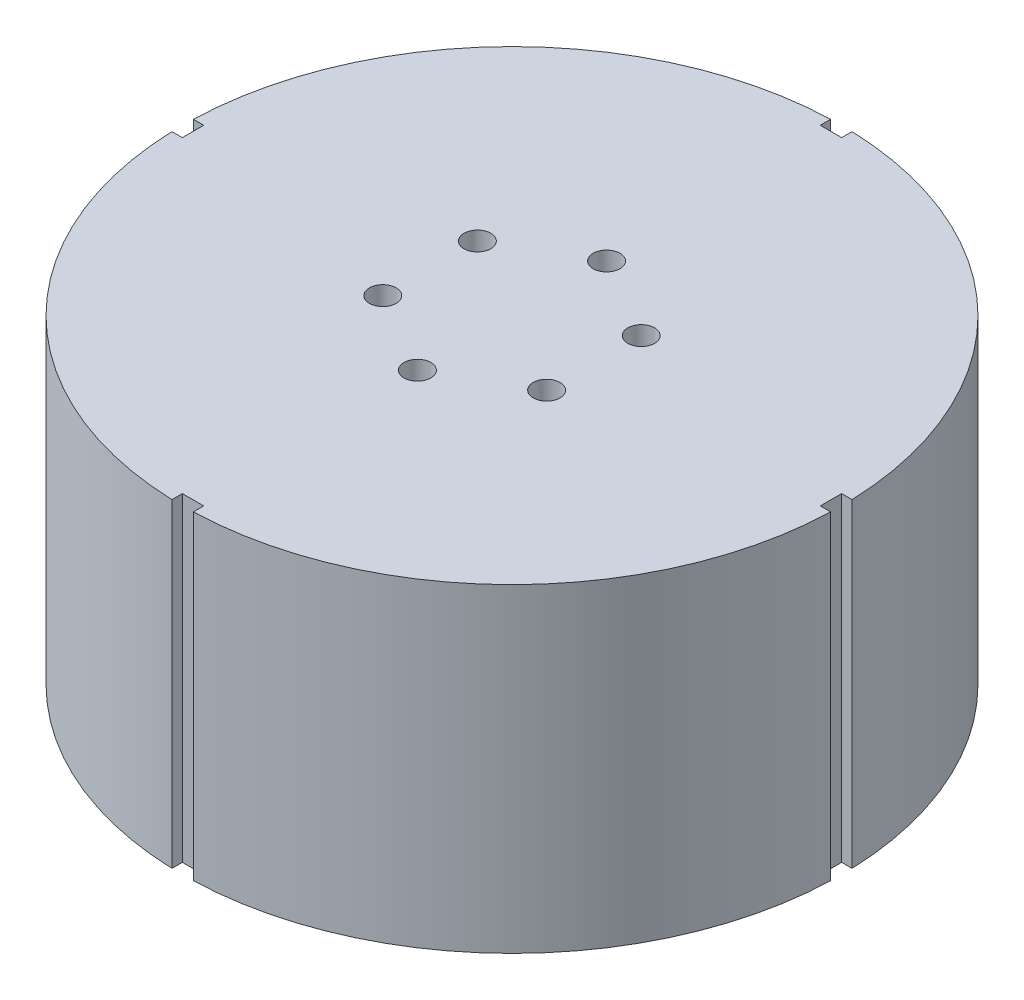
ISO-10303-21;
HEADER;
FILE_DESCRIPTION(('STEP AP214'),'2;1');
FILE_NAME('part.step','',(''),(''),'','','');
FILE_SCHEMA(('AUTOMOTIVE_DESIGN { 1 0 10303 214 1 1 1 1 }'));
ENDSEC;
DATA;
#1=APPLICATION_CONTEXT('core data for automotive mechanical design processes');
#2=APPLICATION_PROTOCOL_DEFINITION('international standard','automotive_design',2000,#1);
#3=PRODUCT_CONTEXT('',#1,'mechanical');
#4=PRODUCT('Part','Part','',(#3));
#5=PRODUCT_RELATED_PRODUCT_CATEGORY('part','',(#4));
#6=PRODUCT_DEFINITION_FORMATION('','',#4);
#7=PRODUCT_DEFINITION_CONTEXT('part definition',#1,'design');
#8=PRODUCT_DEFINITION('design','',#6,#7);
#9=PRODUCT_DEFINITION_SHAPE('','',#8);
#10=(LENGTH_UNIT() NAMED_UNIT(*) SI_UNIT(.MILLI.,.METRE.));
#11=(NAMED_UNIT(*) PLANE_ANGLE_UNIT() SI_UNIT($,.RADIAN.));
#12=(NAMED_UNIT(*) SI_UNIT($,.STERADIAN.) SOLID_ANGLE_UNIT());
#13=UNCERTAINTY_MEASURE_WITH_UNIT(LENGTH_MEASURE(1.E-05),#10,'distance_accuracy_value','');
#14=(GEOMETRIC_REPRESENTATION_CONTEXT(3) GLOBAL_UNCERTAINTY_ASSIGNED_CONTEXT((#13)) GLOBAL_UNIT_ASSIGNED_CONTEXT((#10,
#11,#12)) REPRESENTATION_CONTEXT('',''));
#15=CARTESIAN_POINT('',(0.,0.,0.));
#16=DIRECTION('',(0.,0.,1.));
#17=DIRECTION('',(1.,0.,0.));
#18=AXIS2_PLACEMENT_3D('',#15,#16,#17);
#19=CARTESIAN_POINT('',(13.4233937586588,80.,7.75));
#20=DIRECTION('',(0.,-1.,0.));
#21=DIRECTION('',(0.,0.,-1.));
#22=AXIS2_PLACEMENT_3D('',#19,#20,#21);
#23=CYLINDRICAL_SURFACE('',#22,2.2);
#24=CARTESIAN_POINT('',(13.4233937586588,52.34,7.75));
#25=DIRECTION('',(0.,1.,0.));
#26=DIRECTION('',(0.,0.,1.));
#27=AXIS2_PLACEMENT_3D('',#24,#25,#26);
#28=CIRCLE('',#27,2.2);
#29=CARTESIAN_POINT('',(13.4233937586588,52.34,9.95));
#30=VERTEX_POINT('',#29);
#31=EDGE_CURVE('E394',#30,#30,#28,.T.);
#32=ORIENTED_EDGE('',*,*,#31,.T.);
#33=EDGE_LOOP('',(#32));
#34=FACE_BOUND('',#33,.T.);
#35=CARTESIAN_POINT('',(13.4233937586588,30.,7.75));
#36=DIRECTION('',(0.,-1.,0.));
#37=DIRECTION('',(0.,0.,-1.));
#38=AXIS2_PLACEMENT_3D('',#35,#36,#37);
#39=CIRCLE('',#38,2.2);
#40=CARTESIAN_POINT('',(13.4233937586588,30.,5.55));
#41=VERTEX_POINT('',#40);
#42=EDGE_CURVE('E398',#41,#41,#39,.F.);
#43=ORIENTED_EDGE('',*,*,#42,.F.);
#44=EDGE_LOOP('',(#43));
#45=FACE_BOUND('',#44,.T.);
#46=ADVANCED_FACE('F45',(#34,#45),#23,.F.);
#47=CARTESIAN_POINT('',(13.4233937586588,80.,-7.74999999999999));
#48=DIRECTION('',(0.,-1.,0.));
#49=DIRECTION('',(0.,0.,-1.));
#50=AXIS2_PLACEMENT_3D('',#47,#48,#49);
#51=CYLINDRICAL_SURFACE('',#50,2.2);
#52=CARTESIAN_POINT('',(13.4233937586588,52.34,-7.74999999999999));
#53=DIRECTION('',(0.,1.,0.));
#54=DIRECTION('',(0.,0.,1.));
#55=AXIS2_PLACEMENT_3D('',#52,#53,#54);
#56=CIRCLE('',#55,2.2);
#57=CARTESIAN_POINT('',(13.4233937586588,52.34,-5.54999999999999));
#58=VERTEX_POINT('',#57);
#59=EDGE_CURVE('E390',#58,#58,#56,.T.);
#60=ORIENTED_EDGE('',*,*,#59,.T.);
#61=EDGE_LOOP('',(#60));
#62=FACE_BOUND('',#61,.T.);
#63=CARTESIAN_POINT('',(13.4233937586588,30.,-7.74999999999999));
#64=DIRECTION('',(0.,-1.,0.));
#65=DIRECTION('',(0.,0.,-1.));
#66=AXIS2_PLACEMENT_3D('',#63,#64,#65);
#67=CIRCLE('',#66,2.2);
#68=CARTESIAN_POINT('',(13.4233937586588,30.,-9.94999999999999));
#69=VERTEX_POINT('',#68);
#70=EDGE_CURVE('E402',#69,#69,#67,.F.);
#71=ORIENTED_EDGE('',*,*,#70,.F.);
#72=EDGE_LOOP('',(#71));
#73=FACE_BOUND('',#72,.T.);
#74=ADVANCED_FACE('F445',(#62,#73),#51,.F.);
#75=CARTESIAN_POINT('',(0.,80.,-15.5));
#76=DIRECTION('',(0.,-1.,0.));
#77=DIRECTION('',(0.,0.,-1.));
#78=AXIS2_PLACEMENT_3D('',#75,#76,#77);
#79=CYLINDRICAL_SURFACE('',#78,2.2);
#80=CARTESIAN_POINT('',(0.,52.34,-15.5));
#81=DIRECTION('',(0.,1.,0.));
#82=DIRECTION('',(0.,0.,1.));
#83=AXIS2_PLACEMENT_3D('',#80,#81,#82);
#84=CIRCLE('',#83,2.2);
#85=CARTESIAN_POINT('',(0.,52.34,-13.3));
#86=VERTEX_POINT('',#85);
#87=EDGE_CURVE('E386',#86,#86,#84,.T.);
#88=ORIENTED_EDGE('',*,*,#87,.T.);
#89=EDGE_LOOP('',(#88));
#90=FACE_BOUND('',#89,.T.);
#91=CARTESIAN_POINT('',(0.,30.,-15.5));
#92=DIRECTION('',(0.,-1.,0.));
#93=DIRECTION('',(0.,0.,-1.));
#94=AXIS2_PLACEMENT_3D('',#91,#92,#93);
#95=CIRCLE('',#94,2.2);
#96=CARTESIAN_POINT('',(0.,30.,-17.7));
#97=VERTEX_POINT('',#96);
#98=EDGE_CURVE('E406',#97,#97,#95,.F.);
#99=ORIENTED_EDGE('',*,*,#98,.F.);
#100=EDGE_LOOP('',(#99));
#101=FACE_BOUND('',#100,.T.);
#102=ADVANCED_FACE('F451',(#90,#101),#79,.F.);
#103=CARTESIAN_POINT('',(-13.4233937586588,80.,-7.75000000000001));
#104=DIRECTION('',(0.,-1.,0.));
#105=DIRECTION('',(0.,0.,-1.));
#106=AXIS2_PLACEMENT_3D('',#103,#104,#105);
#107=CYLINDRICAL_SURFACE('',#106,2.2);
#108=CARTESIAN_POINT('',(-13.4233937586588,52.34,-7.75000000000001));
#109=DIRECTION('',(0.,1.,0.));
#110=DIRECTION('',(0.,0.,1.));
#111=AXIS2_PLACEMENT_3D('',#108,#109,#110);
#112=CIRCLE('',#111,2.2);
#113=CARTESIAN_POINT('',(-13.4233937586588,52.34,-5.55));
#114=VERTEX_POINT('',#113);
#115=EDGE_CURVE('E382',#114,#114,#112,.T.);
#116=ORIENTED_EDGE('',*,*,#115,.T.);
#117=EDGE_LOOP('',(#116));
#118=FACE_BOUND('',#117,.T.);
#119=CARTESIAN_POINT('',(-13.4233937586588,30.,-7.75000000000001));
#120=DIRECTION('',(0.,-1.,0.));
#121=DIRECTION('',(0.,0.,-1.));
#122=AXIS2_PLACEMENT_3D('',#119,#120,#121);
#123=CIRCLE('',#122,2.2);
#124=CARTESIAN_POINT('',(-13.4233937586588,30.,-9.95000000000001));
#125=VERTEX_POINT('',#124);
#126=EDGE_CURVE('E410',#125,#125,#123,.F.);
#127=ORIENTED_EDGE('',*,*,#126,.F.);
#128=EDGE_LOOP('',(#127));
#129=FACE_BOUND('',#128,.T.);
#130=ADVANCED_FACE('F461',(#118,#129),#107,.F.);
#131=CARTESIAN_POINT('',(-13.4233937586588,80.,7.75));
#132=DIRECTION('',(0.,-1.,0.));
#133=DIRECTION('',(0.,0.,-1.));
#134=AXIS2_PLACEMENT_3D('',#131,#132,#133);
#135=CYLINDRICAL_SURFACE('',#134,2.2);
#136=CARTESIAN_POINT('',(-13.4233937586588,52.34,7.75));
#137=DIRECTION('',(0.,1.,0.));
#138=DIRECTION('',(0.,0.,1.));
#139=AXIS2_PLACEMENT_3D('',#136,#137,#138);
#140=CIRCLE('',#139,2.2);
#141=CARTESIAN_POINT('',(-13.4233937586588,52.34,9.95));
#142=VERTEX_POINT('',#141);
#143=EDGE_CURVE('E378',#142,#142,#140,.T.);
#144=ORIENTED_EDGE('',*,*,#143,.T.);
#145=EDGE_LOOP('',(#144));
#146=FACE_BOUND('',#145,.T.);
#147=CARTESIAN_POINT('',(-13.4233937586588,30.,7.75));
#148=DIRECTION('',(0.,-1.,0.));
#149=DIRECTION('',(0.,0.,-1.));
#150=AXIS2_PLACEMENT_3D('',#147,#148,#149);
#151=CIRCLE('',#150,2.2);
#152=CARTESIAN_POINT('',(-13.4233937586588,30.,5.55));
#153=VERTEX_POINT('',#152);
#154=EDGE_CURVE('E414',#153,#153,#151,.F.);
#155=ORIENTED_EDGE('',*,*,#154,.F.);
#156=EDGE_LOOP('',(#155));
#157=FACE_BOUND('',#156,.T.);
#158=ADVANCED_FACE('F456',(#146,#157),#135,.F.);
#159=CARTESIAN_POINT('',(0.,80.,15.5));
#160=DIRECTION('',(0.,-1.,0.));
#161=DIRECTION('',(0.,0.,-1.));
#162=AXIS2_PLACEMENT_3D('',#159,#160,#161);
#163=CYLINDRICAL_SURFACE('',#162,2.2);
#164=CARTESIAN_POINT('',(0.,52.34,15.5));
#165=DIRECTION('',(0.,1.,0.));
#166=DIRECTION('',(0.,0.,1.));
#167=AXIS2_PLACEMENT_3D('',#164,#165,#166);
#168=CIRCLE('',#167,2.2);
#169=CARTESIAN_POINT('',(0.,52.34,17.7));
#170=VERTEX_POINT('',#169);
#171=EDGE_CURVE('E238',#170,#170,#168,.T.);
#172=ORIENTED_EDGE('',*,*,#171,.T.);
#173=EDGE_LOOP('',(#172));
#174=FACE_BOUND('',#173,.T.);
#175=CARTESIAN_POINT('',(0.,30.,15.5));
#176=DIRECTION('',(0.,-1.,0.));
#177=DIRECTION('',(0.,0.,-1.));
#178=AXIS2_PLACEMENT_3D('',#175,#176,#177);
#179=CIRCLE('',#178,2.2);
#180=CARTESIAN_POINT('',(0.,30.,13.3));
#181=VERTEX_POINT('',#180);
#182=EDGE_CURVE('E49',#181,#181,#179,.F.);
#183=ORIENTED_EDGE('',*,*,#182,.F.);
#184=EDGE_LOOP('',(#183));
#185=FACE_BOUND('',#184,.T.);
#186=ADVANCED_FACE('F442',(#174,#185),#163,.F.);
#187=CARTESIAN_POINT('',(0.,52.34,52.2716360693281));
#188=DIRECTION('',(0.,0.,-1.));
#189=DIRECTION('',(-1.,0.,0.));
#190=AXIS2_PLACEMENT_3D('',#187,#188,#189);
#191=PLANE('',#190);
#192=DIRECTION('',(1.,0.,0.));
#193=VECTOR('',#192,1.);
#194=CARTESIAN_POINT('',(0.,0.,52.2716360693281));
#195=LINE('',#194,#193);
#196=CARTESIAN_POINT('',(-1.74999999999999,0.,52.2716360693281));
#197=VERTEX_POINT('',#196);
#198=CARTESIAN_POINT('',(1.75000000000001,0.,52.2716360693281));
#199=VERTEX_POINT('',#198);
#200=EDGE_CURVE('E233',#197,#199,#195,.T.);
#201=ORIENTED_EDGE('',*,*,#200,.T.);
#202=DIRECTION('',(0.,-1.,0.));
#203=VECTOR('',#202,1.);
#204=CARTESIAN_POINT('',(1.75000000000001,52.34,52.2716360693281));
#205=LINE('',#204,#203);
#206=CARTESIAN_POINT('',(1.75000000000001,52.34,52.2716360693281));
#207=VERTEX_POINT('',#206);
#208=EDGE_CURVE('E11',#207,#199,#205,.T.);
#209=ORIENTED_EDGE('',*,*,#208,.F.);
#210=DIRECTION('',(1.,0.,0.));
#211=VECTOR('',#210,1.);
#212=CARTESIAN_POINT('',(0.,52.34,52.2716360693281));
#213=LINE('',#212,#211);
#214=CARTESIAN_POINT('',(-1.74999999999999,52.34,52.2716360693281));
#215=VERTEX_POINT('',#214);
#216=EDGE_CURVE('E209',#215,#207,#213,.T.);
#217=ORIENTED_EDGE('',*,*,#216,.F.);
#218=DIRECTION('',(0.,-1.,0.));
#219=VECTOR('',#218,1.);
#220=CARTESIAN_POINT('',(-1.74999999999999,52.34,52.2716360693281));
#221=LINE('',#220,#219);
#222=EDGE_CURVE('E194',#215,#197,#221,.T.);
#223=ORIENTED_EDGE('',*,*,#222,.T.);
#224=EDGE_LOOP('',(#201,#209,#217,#223));
#225=FACE_BOUND('',#224,.T.);
#226=ADVANCED_FACE('F47',(#225),#191,.F.);
#227=CARTESIAN_POINT('',(1.74999999999997,52.34,0.));
#228=DIRECTION('',(1.,0.,0.));
#229=DIRECTION('',(0.,0.,-1.));
#230=AXIS2_PLACEMENT_3D('',#227,#228,#229);
#231=PLANE('',#230);
#232=DIRECTION('',(0.,0.,1.));
#233=VECTOR('',#232,1.);
#234=CARTESIAN_POINT('',(1.74999999999997,0.,0.));
#235=LINE('',#234,#233);
#236=CARTESIAN_POINT('',(1.75000000000001,0.,53.9716360693281));
#237=VERTEX_POINT('',#236);
#238=EDGE_CURVE('E237',#199,#237,#235,.T.);
#239=ORIENTED_EDGE('',*,*,#238,.T.);
#240=DIRECTION('',(0.,-1.,0.));
#241=VECTOR('',#240,1.);
#242=CARTESIAN_POINT('',(1.75000000000001,52.34,53.9716360693281));
#243=LINE('',#242,#241);
#244=CARTESIAN_POINT('',(1.75000000000001,52.34,53.9716360693281));
#245=VERTEX_POINT('',#244);
#246=EDGE_CURVE('E56',#245,#237,#243,.T.);
#247=ORIENTED_EDGE('',*,*,#246,.F.);
#248=DIRECTION('',(0.,0.,1.));
#249=VECTOR('',#248,1.);
#250=CARTESIAN_POINT('',(1.74999999999997,52.34,0.));
#251=LINE('',#250,#249);
#252=EDGE_CURVE('E131',#207,#245,#251,.T.);
#253=ORIENTED_EDGE('',*,*,#252,.F.);
#254=ORIENTED_EDGE('',*,*,#208,.T.);
#255=EDGE_LOOP('',(#239,#247,#253,#254));
#256=FACE_BOUND('',#255,.T.);
#257=ADVANCED_FACE('F435',(#256),#231,.F.);
#258=CARTESIAN_POINT('',(0.,52.34,0.));
#259=DIRECTION('',(0.,-1.,0.));
#260=DIRECTION('',(0.,0.,-1.));
#261=AXIS2_PLACEMENT_3D('',#258,#259,#260);
#262=CYLINDRICAL_SURFACE('',#261,54.);
#263=CARTESIAN_POINT('',(0.,0.,0.));
#264=DIRECTION('',(0.,1.,0.));
#265=DIRECTION('',(0.,0.,1.));
#266=AXIS2_PLACEMENT_3D('',#263,#264,#265);
#267=CIRCLE('',#266,54.);
#268=CARTESIAN_POINT('',(53.9716360693281,0.,1.74999999999998));
#269=VERTEX_POINT('',#268);
#270=EDGE_CURVE('E241',#237,#269,#267,.T.);
#271=ORIENTED_EDGE('',*,*,#270,.T.);
#272=DIRECTION('',(0.,-1.,0.));
#273=VECTOR('',#272,1.);
#274=CARTESIAN_POINT('',(53.9716360693281,52.34,1.74999999999998));
#275=LINE('',#274,#273);
#276=CARTESIAN_POINT('',(53.9716360693281,52.34,1.74999999999998));
#277=VERTEX_POINT('',#276);
#278=EDGE_CURVE('E316',#277,#269,#275,.T.);
#279=ORIENTED_EDGE('',*,*,#278,.F.);
#280=CARTESIAN_POINT('',(0.,52.34,0.));
#281=DIRECTION('',(0.,1.,0.));
#282=DIRECTION('',(0.,0.,1.));
#283=AXIS2_PLACEMENT_3D('',#280,#281,#282);
#284=CIRCLE('',#283,54.);
#285=EDGE_CURVE('E192',#245,#277,#284,.T.);
#286=ORIENTED_EDGE('',*,*,#285,.F.);
#287=ORIENTED_EDGE('',*,*,#246,.T.);
#288=EDGE_LOOP('',(#271,#279,#286,#287));
#289=FACE_BOUND('',#288,.T.);
#290=ADVANCED_FACE('F324',(#289),#262,.T.);
#291=CARTESIAN_POINT('',(0.,52.34,1.74999999999999));
#292=DIRECTION('',(0.,0.,1.));
#293=DIRECTION('',(1.,0.,0.));
#294=AXIS2_PLACEMENT_3D('',#291,#292,#293);
#295=PLANE('',#294);
#296=DIRECTION('',(-1.,0.,0.));
#297=VECTOR('',#296,1.);
#298=CARTESIAN_POINT('',(0.,0.,1.74999999999999));
#299=LINE('',#298,#297);
#300=CARTESIAN_POINT('',(52.2716360693281,0.,1.74999999999998));
#301=VERTEX_POINT('',#300);
#302=EDGE_CURVE('E244',#269,#301,#299,.T.);
#303=ORIENTED_EDGE('',*,*,#302,.T.);
#304=DIRECTION('',(0.,-1.,0.));
#305=VECTOR('',#304,1.);
#306=CARTESIAN_POINT('',(52.2716360693281,52.34,1.74999999999998));
#307=LINE('',#306,#305);
#308=CARTESIAN_POINT('',(52.2716360693281,52.34,1.74999999999998));
#309=VERTEX_POINT('',#308);
#310=EDGE_CURVE('E312',#309,#301,#307,.T.);
#311=ORIENTED_EDGE('',*,*,#310,.F.);
#312=DIRECTION('',(-1.,0.,0.));
#313=VECTOR('',#312,1.);
#314=CARTESIAN_POINT('',(0.,52.34,1.74999999999999));
#315=LINE('',#314,#313);
#316=EDGE_CURVE('E203',#277,#309,#315,.T.);
#317=ORIENTED_EDGE('',*,*,#316,.F.);
#318=ORIENTED_EDGE('',*,*,#278,.T.);
#319=EDGE_LOOP('',(#303,#311,#317,#318));
#320=FACE_BOUND('',#319,.T.);
#321=ADVANCED_FACE('F333',(#320),#295,.F.);
#322=CARTESIAN_POINT('',(52.2716360693281,52.34,0.));
#323=DIRECTION('',(-1.,0.,0.));
#324=DIRECTION('',(0.,0.,1.));
#325=AXIS2_PLACEMENT_3D('',#322,#323,#324);
#326=PLANE('',#325);
#327=DIRECTION('',(0.,0.,-1.));
#328=VECTOR('',#327,1.);
#329=CARTESIAN_POINT('',(52.2716360693281,0.,0.));
#330=LINE('',#329,#328);
#331=CARTESIAN_POINT('',(52.2716360693281,0.,-1.75000000000002));
#332=VERTEX_POINT('',#331);
#333=EDGE_CURVE('E248',#301,#332,#330,.T.);
#334=ORIENTED_EDGE('',*,*,#333,.T.);
#335=DIRECTION('',(0.,-1.,0.));
#336=VECTOR('',#335,1.);
#337=CARTESIAN_POINT('',(52.2716360693281,52.34,-1.75000000000002));
#338=LINE('',#337,#336);
#339=CARTESIAN_POINT('',(52.2716360693281,52.34,-1.75000000000002));
#340=VERTEX_POINT('',#339);
#341=EDGE_CURVE('E308',#340,#332,#338,.T.);
#342=ORIENTED_EDGE('',*,*,#341,.F.);
#343=DIRECTION('',(0.,0.,-1.));
#344=VECTOR('',#343,1.);
#345=CARTESIAN_POINT('',(52.2716360693281,52.34,0.));
#346=LINE('',#345,#344);
#347=EDGE_CURVE('E208',#309,#340,#346,.T.);
#348=ORIENTED_EDGE('',*,*,#347,.F.);
#349=ORIENTED_EDGE('',*,*,#310,.T.);
#350=EDGE_LOOP('',(#334,#342,#348,#349));
#351=FACE_BOUND('',#350,.T.);
#352=ADVANCED_FACE('F337',(#351),#326,.F.);
#353=CARTESIAN_POINT('',(0.,52.34,-1.74999999999997));
#354=DIRECTION('',(0.,0.,-1.));
#355=DIRECTION('',(-1.,0.,0.));
#356=AXIS2_PLACEMENT_3D('',#353,#354,#355);
#357=PLANE('',#356);
#358=DIRECTION('',(1.,0.,0.));
#359=VECTOR('',#358,1.);
#360=CARTESIAN_POINT('',(0.,0.,-1.74999999999997));
#361=LINE('',#360,#359);
#362=CARTESIAN_POINT('',(53.9716360693281,0.,-1.75000000000002));
#363=VERTEX_POINT('',#362);
#364=EDGE_CURVE('E251',#332,#363,#361,.T.);
#365=ORIENTED_EDGE('',*,*,#364,.T.);
#366=DIRECTION('',(0.,-1.,0.));
#367=VECTOR('',#366,1.);
#368=CARTESIAN_POINT('',(53.9716360693281,52.34,-1.75000000000002));
#369=LINE('',#368,#367);
#370=CARTESIAN_POINT('',(53.9716360693281,52.34,-1.75000000000002));
#371=VERTEX_POINT('',#370);
#372=EDGE_CURVE('E304',#371,#363,#369,.T.);
#373=ORIENTED_EDGE('',*,*,#372,.F.);
#374=DIRECTION('',(1.,0.,0.));
#375=VECTOR('',#374,1.);
#376=CARTESIAN_POINT('',(0.,52.34,-1.74999999999997));
#377=LINE('',#376,#375);
#378=EDGE_CURVE('E212',#340,#371,#377,.T.);
#379=ORIENTED_EDGE('',*,*,#378,.F.);
#380=ORIENTED_EDGE('',*,*,#341,.T.);
#381=EDGE_LOOP('',(#365,#373,#379,#380));
#382=FACE_BOUND('',#381,.T.);
#383=ADVANCED_FACE('F340',(#382),#357,.F.);
#384=CARTESIAN_POINT('',(1.74999999999999,0.,-53.9716360693281));
#385=VERTEX_POINT('',#384);
#386=EDGE_CURVE('E245',#363,#385,#267,.T.);
#387=ORIENTED_EDGE('',*,*,#386,.T.);
#388=DIRECTION('',(0.,-1.,0.));
#389=VECTOR('',#388,1.);
#390=CARTESIAN_POINT('',(1.74999999999999,52.34,-53.9716360693281));
#391=LINE('',#390,#389);
#392=CARTESIAN_POINT('',(1.74999999999999,52.34,-53.9716360693281));
#393=VERTEX_POINT('',#392);
#394=EDGE_CURVE('E300',#393,#385,#391,.T.);
#395=ORIENTED_EDGE('',*,*,#394,.F.);
#396=EDGE_CURVE('E201',#371,#393,#284,.T.);
#397=ORIENTED_EDGE('',*,*,#396,.F.);
#398=ORIENTED_EDGE('',*,*,#372,.T.);
#399=EDGE_LOOP('',(#387,#395,#397,#398));
#400=FACE_BOUND('',#399,.T.);
#401=ADVANCED_FACE('F343',(#400),#262,.T.);
#402=CARTESIAN_POINT('',(1.74999999999999,52.34,0.));
#403=DIRECTION('',(1.,0.,0.));
#404=DIRECTION('',(0.,0.,-1.));
#405=AXIS2_PLACEMENT_3D('',#402,#403,#404);
#406=PLANE('',#405);
#407=DIRECTION('',(0.,0.,1.));
#408=VECTOR('',#407,1.);
#409=CARTESIAN_POINT('',(1.74999999999999,0.,0.));
#410=LINE('',#409,#408);
#411=CARTESIAN_POINT('',(1.74999999999999,0.,-52.2716360693281));
#412=VERTEX_POINT('',#411);
#413=EDGE_CURVE('E254',#385,#412,#410,.T.);
#414=ORIENTED_EDGE('',*,*,#413,.T.);
#415=DIRECTION('',(0.,-1.,0.));
#416=VECTOR('',#415,1.);
#417=CARTESIAN_POINT('',(1.74999999999999,52.34,-52.2716360693281));
#418=LINE('',#417,#416);
#419=CARTESIAN_POINT('',(1.74999999999999,52.34,-52.2716360693281));
#420=VERTEX_POINT('',#419);
#421=EDGE_CURVE('E296',#420,#412,#418,.T.);
#422=ORIENTED_EDGE('',*,*,#421,.F.);
#423=DIRECTION('',(0.,0.,1.));
#424=VECTOR('',#423,1.);
#425=CARTESIAN_POINT('',(1.74999999999999,52.34,0.));
#426=LINE('',#425,#424);
#427=EDGE_CURVE('E211',#393,#420,#426,.T.);
#428=ORIENTED_EDGE('',*,*,#427,.F.);
#429=ORIENTED_EDGE('',*,*,#394,.T.);
#430=EDGE_LOOP('',(#414,#422,#428,#429));
#431=FACE_BOUND('',#430,.T.);
#432=ADVANCED_FACE('F348',(#431),#406,.F.);
#433=CARTESIAN_POINT('',(0.,52.34,-52.2716360693281));
#434=DIRECTION('',(0.,0.,1.));
#435=DIRECTION('',(1.,0.,0.));
#436=AXIS2_PLACEMENT_3D('',#433,#434,#435);
#437=PLANE('',#436);
#438=DIRECTION('',(-1.,0.,0.));
#439=VECTOR('',#438,1.);
#440=CARTESIAN_POINT('',(0.,0.,-52.2716360693281));
#441=LINE('',#440,#439);
#442=CARTESIAN_POINT('',(-1.75000000000001,0.,-52.2716360693281));
#443=VERTEX_POINT('',#442);
#444=EDGE_CURVE('E257',#412,#443,#441,.T.);
#445=ORIENTED_EDGE('',*,*,#444,.T.);
#446=DIRECTION('',(0.,-1.,0.));
#447=VECTOR('',#446,1.);
#448=CARTESIAN_POINT('',(-1.75000000000001,52.34,-52.2716360693281));
#449=LINE('',#448,#447);
#450=CARTESIAN_POINT('',(-1.75000000000001,52.34,-52.2716360693281));
#451=VERTEX_POINT('',#450);
#452=EDGE_CURVE('E292',#451,#443,#449,.T.);
#453=ORIENTED_EDGE('',*,*,#452,.F.);
#454=DIRECTION('',(-1.,0.,0.));
#455=VECTOR('',#454,1.);
#456=CARTESIAN_POINT('',(0.,52.34,-52.2716360693281));
#457=LINE('',#456,#455);
#458=EDGE_CURVE('E217',#420,#451,#457,.T.);
#459=ORIENTED_EDGE('',*,*,#458,.F.);
#460=ORIENTED_EDGE('',*,*,#421,.T.);
#461=EDGE_LOOP('',(#445,#453,#459,#460));
#462=FACE_BOUND('',#461,.T.);
#463=ADVANCED_FACE('F354',(#462),#437,.F.);
#464=CARTESIAN_POINT('',(-1.74999999999997,52.34,0.));
#465=DIRECTION('',(-1.,0.,0.));
#466=DIRECTION('',(0.,0.,1.));
#467=AXIS2_PLACEMENT_3D('',#464,#465,#466);
#468=PLANE('',#467);
#469=DIRECTION('',(0.,0.,-1.));
#470=VECTOR('',#469,1.);
#471=CARTESIAN_POINT('',(-1.74999999999997,0.,0.));
#472=LINE('',#471,#470);
#473=CARTESIAN_POINT('',(-1.75000000000001,0.,-53.9716360693281));
#474=VERTEX_POINT('',#473);
#475=EDGE_CURVE('E260',#443,#474,#472,.T.);
#476=ORIENTED_EDGE('',*,*,#475,.T.);
#477=DIRECTION('',(0.,-1.,0.));
#478=VECTOR('',#477,1.);
#479=CARTESIAN_POINT('',(-1.75000000000001,52.34,-53.9716360693281));
#480=LINE('',#479,#478);
#481=CARTESIAN_POINT('',(-1.75000000000001,52.34,-53.9716360693281));
#482=VERTEX_POINT('',#481);
#483=EDGE_CURVE('E288',#482,#474,#480,.T.);
#484=ORIENTED_EDGE('',*,*,#483,.F.);
#485=DIRECTION('',(0.,0.,-1.));
#486=VECTOR('',#485,1.);
#487=CARTESIAN_POINT('',(-1.74999999999997,52.34,0.));
#488=LINE('',#487,#486);
#489=EDGE_CURVE('E200',#451,#482,#488,.T.);
#490=ORIENTED_EDGE('',*,*,#489,.F.);
#491=ORIENTED_EDGE('',*,*,#452,.T.);
#492=EDGE_LOOP('',(#476,#484,#490,#491));
#493=FACE_BOUND('',#492,.T.);
#494=ADVANCED_FACE('F358',(#493),#468,.F.);
#495=CARTESIAN_POINT('',(-53.9716360693281,0.,-1.74999999999999));
#496=VERTEX_POINT('',#495);
#497=EDGE_CURVE('E263',#474,#496,#267,.T.);
#498=ORIENTED_EDGE('',*,*,#497,.T.);
#499=DIRECTION('',(0.,-1.,0.));
#500=VECTOR('',#499,1.);
#501=CARTESIAN_POINT('',(-53.9716360693281,52.34,-1.74999999999999));
#502=LINE('',#501,#500);
#503=CARTESIAN_POINT('',(-53.9716360693281,52.34,-1.74999999999999));
#504=VERTEX_POINT('',#503);
#505=EDGE_CURVE('E284',#504,#496,#502,.T.);
#506=ORIENTED_EDGE('',*,*,#505,.F.);
#507=EDGE_CURVE('E191',#482,#504,#284,.T.);
#508=ORIENTED_EDGE('',*,*,#507,.F.);
#509=ORIENTED_EDGE('',*,*,#483,.T.);
#510=EDGE_LOOP('',(#498,#506,#508,#509));
#511=FACE_BOUND('',#510,.T.);
#512=ADVANCED_FACE('F363',(#511),#262,.T.);
#513=CARTESIAN_POINT('',(0.,52.34,-1.75));
#514=DIRECTION('',(0.,0.,-1.));
#515=DIRECTION('',(-1.,0.,0.));
#516=AXIS2_PLACEMENT_3D('',#513,#514,#515);
#517=PLANE('',#516);
#518=DIRECTION('',(1.,0.,0.));
#519=VECTOR('',#518,1.);
#520=CARTESIAN_POINT('',(0.,0.,-1.75));
#521=LINE('',#520,#519);
#522=CARTESIAN_POINT('',(-52.2716360693281,0.,-1.74999999999999));
#523=VERTEX_POINT('',#522);
#524=EDGE_CURVE('E264',#496,#523,#521,.T.);
#525=ORIENTED_EDGE('',*,*,#524,.T.);
#526=DIRECTION('',(0.,-1.,0.));
#527=VECTOR('',#526,1.);
#528=CARTESIAN_POINT('',(-52.2716360693281,52.34,-1.74999999999999));
#529=LINE('',#528,#527);
#530=CARTESIAN_POINT('',(-52.2716360693281,52.34,-1.74999999999999));
#531=VERTEX_POINT('',#530);
#532=EDGE_CURVE('E280',#531,#523,#529,.T.);
#533=ORIENTED_EDGE('',*,*,#532,.F.);
#534=DIRECTION('',(1.,0.,0.));
#535=VECTOR('',#534,1.);
#536=CARTESIAN_POINT('',(0.,52.34,-1.75));
#537=LINE('',#536,#535);
#538=EDGE_CURVE('E199',#504,#531,#537,.T.);
#539=ORIENTED_EDGE('',*,*,#538,.F.);
#540=ORIENTED_EDGE('',*,*,#505,.T.);
#541=EDGE_LOOP('',(#525,#533,#539,#540));
#542=FACE_BOUND('',#541,.T.);
#543=ADVANCED_FACE('F367',(#542),#517,.F.);
#544=CARTESIAN_POINT('',(-52.2716360693281,52.34,0.));
#545=DIRECTION('',(1.,0.,0.));
#546=DIRECTION('',(0.,0.,-1.));
#547=AXIS2_PLACEMENT_3D('',#544,#545,#546);
#548=PLANE('',#547);
#549=DIRECTION('',(0.,0.,1.));
#550=VECTOR('',#549,1.);
#551=CARTESIAN_POINT('',(-52.2716360693281,0.,0.));
#552=LINE('',#551,#550);
#553=CARTESIAN_POINT('',(-52.2716360693281,0.,1.75000000000001));
#554=VERTEX_POINT('',#553);
#555=EDGE_CURVE('E267',#523,#554,#552,.T.);
#556=ORIENTED_EDGE('',*,*,#555,.T.);
#557=DIRECTION('',(0.,-1.,0.));
#558=VECTOR('',#557,1.);
#559=CARTESIAN_POINT('',(-52.2716360693281,52.34,1.75000000000001));
#560=LINE('',#559,#558);
#561=CARTESIAN_POINT('',(-52.2716360693281,52.34,1.75000000000001));
#562=VERTEX_POINT('',#561);
#563=EDGE_CURVE('E185',#562,#554,#560,.T.);
#564=ORIENTED_EDGE('',*,*,#563,.F.);
#565=DIRECTION('',(0.,0.,1.));
#566=VECTOR('',#565,1.);
#567=CARTESIAN_POINT('',(-52.2716360693281,52.34,0.));
#568=LINE('',#567,#566);
#569=EDGE_CURVE('E174',#531,#562,#568,.T.);
#570=ORIENTED_EDGE('',*,*,#569,.F.);
#571=ORIENTED_EDGE('',*,*,#532,.T.);
#572=EDGE_LOOP('',(#556,#564,#570,#571));
#573=FACE_BOUND('',#572,.T.);
#574=ADVANCED_FACE('F371',(#573),#548,.F.);
#575=CARTESIAN_POINT('',(0.,52.34,1.74999999999996));
#576=DIRECTION('',(0.,0.,1.));
#577=DIRECTION('',(1.,0.,0.));
#578=AXIS2_PLACEMENT_3D('',#575,#576,#577);
#579=PLANE('',#578);
#580=DIRECTION('',(-1.,0.,0.));
#581=VECTOR('',#580,1.);
#582=CARTESIAN_POINT('',(0.,0.,1.74999999999996));
#583=LINE('',#582,#581);
#584=CARTESIAN_POINT('',(-53.9716360693281,0.,1.75000000000001));
#585=VERTEX_POINT('',#584);
#586=EDGE_CURVE('E183',#554,#585,#583,.T.);
#587=ORIENTED_EDGE('',*,*,#586,.T.);
#588=DIRECTION('',(0.,-1.,0.));
#589=VECTOR('',#588,1.);
#590=CARTESIAN_POINT('',(-53.9716360693281,52.34,1.75000000000001));
#591=LINE('',#590,#589);
#592=CARTESIAN_POINT('',(-53.9716360693281,52.34,1.75000000000001));
#593=VERTEX_POINT('',#592);
#594=EDGE_CURVE('E180',#593,#585,#591,.T.);
#595=ORIENTED_EDGE('',*,*,#594,.F.);
#596=DIRECTION('',(-1.,0.,0.));
#597=VECTOR('',#596,1.);
#598=CARTESIAN_POINT('',(0.,52.34,1.74999999999996));
#599=LINE('',#598,#597);
#600=EDGE_CURVE('E168',#562,#593,#599,.T.);
#601=ORIENTED_EDGE('',*,*,#600,.F.);
#602=ORIENTED_EDGE('',*,*,#563,.T.);
#603=EDGE_LOOP('',(#587,#595,#601,#602));
#604=FACE_BOUND('',#603,.T.);
#605=ADVANCED_FACE('F181',(#604),#579,.F.);
#606=CARTESIAN_POINT('',(-1.74999999999999,0.,53.9716360693281));
#607=VERTEX_POINT('',#606);
#608=EDGE_CURVE('E117',#585,#607,#267,.T.);
#609=ORIENTED_EDGE('',*,*,#608,.T.);
#610=DIRECTION('',(0.,-1.,0.));
#611=VECTOR('',#610,1.);
#612=CARTESIAN_POINT('',(-1.74999999999999,52.34,53.9716360693281));
#613=LINE('',#612,#611);
#614=CARTESIAN_POINT('',(-1.74999999999999,52.34,53.9716360693281));
#615=VERTEX_POINT('',#614);
#616=EDGE_CURVE('E186',#615,#607,#613,.T.);
#617=ORIENTED_EDGE('',*,*,#616,.F.);
#618=EDGE_CURVE('E172',#593,#615,#284,.T.);
#619=ORIENTED_EDGE('',*,*,#618,.F.);
#620=ORIENTED_EDGE('',*,*,#594,.T.);
#621=EDGE_LOOP('',(#609,#617,#619,#620));
#622=FACE_BOUND('',#621,.T.);
#623=ADVANCED_FACE('F188',(#622),#262,.T.);
#624=CARTESIAN_POINT('',(-1.74999999999999,52.34,0.));
#625=DIRECTION('',(-1.,0.,0.));
#626=DIRECTION('',(0.,0.,1.));
#627=AXIS2_PLACEMENT_3D('',#624,#625,#626);
#628=PLANE('',#627);
#629=DIRECTION('',(0.,0.,-1.));
#630=VECTOR('',#629,1.);
#631=CARTESIAN_POINT('',(-1.74999999999999,0.,0.));
#632=LINE('',#631,#630);
#633=EDGE_CURVE('E123',#607,#197,#632,.T.);
#634=ORIENTED_EDGE('',*,*,#633,.T.);
#635=ORIENTED_EDGE('',*,*,#222,.F.);
#636=DIRECTION('',(0.,0.,-1.));
#637=VECTOR('',#636,1.);
#638=CARTESIAN_POINT('',(-1.74999999999999,52.34,0.));
#639=LINE('',#638,#637);
#640=EDGE_CURVE('E64',#615,#215,#639,.T.);
#641=ORIENTED_EDGE('',*,*,#640,.F.);
#642=ORIENTED_EDGE('',*,*,#616,.T.);
#643=EDGE_LOOP('',(#634,#635,#641,#642));
#644=FACE_BOUND('',#643,.T.);
#645=ADVANCED_FACE('F468',(#644),#628,.F.);
#646=CARTESIAN_POINT('',(0.,52.34,0.));
#647=DIRECTION('',(0.,1.,0.));
#648=DIRECTION('',(0.,0.,1.));
#649=AXIS2_PLACEMENT_3D('',#646,#647,#648);
#650=PLANE('',#649);
#651=ORIENTED_EDGE('',*,*,#171,.F.);
#652=EDGE_LOOP('',(#651));
#653=FACE_BOUND('',#652,.T.);
#654=ORIENTED_EDGE('',*,*,#143,.F.);
#655=EDGE_LOOP('',(#654));
#656=FACE_BOUND('',#655,.T.);
#657=ORIENTED_EDGE('',*,*,#115,.F.);
#658=EDGE_LOOP('',(#657));
#659=FACE_BOUND('',#658,.T.);
#660=ORIENTED_EDGE('',*,*,#87,.F.);
#661=EDGE_LOOP('',(#660));
#662=FACE_BOUND('',#661,.T.);
#663=ORIENTED_EDGE('',*,*,#59,.F.);
#664=EDGE_LOOP('',(#663));
#665=FACE_BOUND('',#664,.T.);
#666=ORIENTED_EDGE('',*,*,#31,.F.);
#667=EDGE_LOOP('',(#666));
#668=FACE_BOUND('',#667,.T.);
#669=ORIENTED_EDGE('',*,*,#216,.T.);
#670=ORIENTED_EDGE('',*,*,#252,.T.);
#671=ORIENTED_EDGE('',*,*,#285,.T.);
#672=ORIENTED_EDGE('',*,*,#316,.T.);
#673=ORIENTED_EDGE('',*,*,#347,.T.);
#674=ORIENTED_EDGE('',*,*,#378,.T.);
#675=ORIENTED_EDGE('',*,*,#396,.T.);
#676=ORIENTED_EDGE('',*,*,#427,.T.);
#677=ORIENTED_EDGE('',*,*,#458,.T.);
#678=ORIENTED_EDGE('',*,*,#489,.T.);
#679=ORIENTED_EDGE('',*,*,#507,.T.);
#680=ORIENTED_EDGE('',*,*,#538,.T.);
#681=ORIENTED_EDGE('',*,*,#569,.T.);
#682=ORIENTED_EDGE('',*,*,#600,.T.);
#683=ORIENTED_EDGE('',*,*,#618,.T.);
#684=ORIENTED_EDGE('',*,*,#640,.T.);
#685=EDGE_LOOP('',(#669,#670,#671,#672,#673,#674,#675,#676,#677,#678,#679,#680,#681,#682,#683,#684));
#686=FACE_BOUND('',#685,.T.);
#687=ADVANCED_FACE('F170',(#653,#656,#659,#662,#665,#668,#686),#650,.T.);
#688=CARTESIAN_POINT('',(0.,0.,0.));
#689=DIRECTION('',(0.,1.,0.));
#690=DIRECTION('',(0.,0.,1.));
#691=AXIS2_PLACEMENT_3D('',#688,#689,#690);
#692=PLANE('',#691);
#693=CARTESIAN_POINT('',(0.,0.,0.));
#694=DIRECTION('',(0.,-1.,0.));
#695=DIRECTION('',(0.,0.,-1.));
#696=AXIS2_PLACEMENT_3D('',#693,#694,#695);
#697=CIRCLE('',#696,49.6);
#698=CARTESIAN_POINT('',(0.,0.,-49.6));
#699=VERTEX_POINT('',#698);
#700=EDGE_CURVE('E424',#699,#699,#697,.T.);
#701=ORIENTED_EDGE('',*,*,#700,.F.);
#702=EDGE_LOOP('',(#701));
#703=FACE_BOUND('',#702,.T.);
#704=ORIENTED_EDGE('',*,*,#200,.F.);
#705=ORIENTED_EDGE('',*,*,#633,.F.);
#706=ORIENTED_EDGE('',*,*,#608,.F.);
#707=ORIENTED_EDGE('',*,*,#586,.F.);
#708=ORIENTED_EDGE('',*,*,#555,.F.);
#709=ORIENTED_EDGE('',*,*,#524,.F.);
#710=ORIENTED_EDGE('',*,*,#497,.F.);
#711=ORIENTED_EDGE('',*,*,#475,.F.);
#712=ORIENTED_EDGE('',*,*,#444,.F.);
#713=ORIENTED_EDGE('',*,*,#413,.F.);
#714=ORIENTED_EDGE('',*,*,#386,.F.);
#715=ORIENTED_EDGE('',*,*,#364,.F.);
#716=ORIENTED_EDGE('',*,*,#333,.F.);
#717=ORIENTED_EDGE('',*,*,#302,.F.);
#718=ORIENTED_EDGE('',*,*,#270,.F.);
#719=ORIENTED_EDGE('',*,*,#238,.F.);
#720=EDGE_LOOP('',(#704,#705,#706,#707,#708,#709,#710,#711,#712,#713,#714,#715,#716,#717,#718,#719));
#721=FACE_BOUND('',#720,.T.);
#722=ADVANCED_FACE('F328',(#703,#721),#692,.F.);
#723=CARTESIAN_POINT('',(0.,30.,0.));
#724=DIRECTION('',(0.,-1.,0.));
#725=DIRECTION('',(0.,0.,-1.));
#726=AXIS2_PLACEMENT_3D('',#723,#724,#725);
#727=PLANE('',#726);
#728=CARTESIAN_POINT('',(0.,30.,0.));
#729=DIRECTION('',(0.,-1.,0.));
#730=DIRECTION('',(0.,0.,-1.));
#731=AXIS2_PLACEMENT_3D('',#728,#729,#730);
#732=CIRCLE('',#731,49.6);
#733=CARTESIAN_POINT('',(0.,30.,-49.6));
#734=VERTEX_POINT('',#733);
#735=EDGE_CURVE('E421',#734,#734,#732,.T.);
#736=ORIENTED_EDGE('',*,*,#735,.T.);
#737=EDGE_LOOP('',(#736));
#738=FACE_BOUND('',#737,.T.);
#739=ORIENTED_EDGE('',*,*,#182,.T.);
#740=EDGE_LOOP('',(#739));
#741=FACE_BOUND('',#740,.T.);
#742=ORIENTED_EDGE('',*,*,#154,.T.);
#743=EDGE_LOOP('',(#742));
#744=FACE_BOUND('',#743,.T.);
#745=ORIENTED_EDGE('',*,*,#126,.T.);
#746=EDGE_LOOP('',(#745));
#747=FACE_BOUND('',#746,.T.);
#748=ORIENTED_EDGE('',*,*,#98,.T.);
#749=EDGE_LOOP('',(#748));
#750=FACE_BOUND('',#749,.T.);
#751=ORIENTED_EDGE('',*,*,#70,.T.);
#752=EDGE_LOOP('',(#751));
#753=FACE_BOUND('',#752,.T.);
#754=ORIENTED_EDGE('',*,*,#42,.T.);
#755=EDGE_LOOP('',(#754));
#756=FACE_BOUND('',#755,.T.);
#757=ADVANCED_FACE('F472',(#738,#741,#744,#747,#750,#753,#756),#727,.T.);
#758=CARTESIAN_POINT('',(0.,30.,0.));
#759=DIRECTION('',(0.,-1.,0.));
#760=DIRECTION('',(0.,0.,-1.));
#761=AXIS2_PLACEMENT_3D('',#758,#759,#760);
#762=CYLINDRICAL_SURFACE('',#761,49.6);
#763=ORIENTED_EDGE('',*,*,#735,.F.);
#764=EDGE_LOOP('',(#763));
#765=FACE_BOUND('',#764,.T.);
#766=ORIENTED_EDGE('',*,*,#700,.T.);
#767=EDGE_LOOP('',(#766));
#768=FACE_BOUND('',#767,.T.);
#769=ADVANCED_FACE('F562',(#765,#768),#762,.F.);
#770=CLOSED_SHELL('',(#46,#74,#102,#130,#158,#186,#226,#257,#290,#321,#352,#383,#401,#432,#463,
#494,#512,#543,#574,#605,#623,#645,#687,#722,#757,#769));
#771=MANIFOLD_SOLID_BREP('B2',#770);
#772=ADVANCED_BREP_SHAPE_REPRESENTATION('',(#18,#771),#14);
#773=SHAPE_DEFINITION_REPRESENTATION(#9,#772);
ENDSEC;
END-ISO-10303-21;
